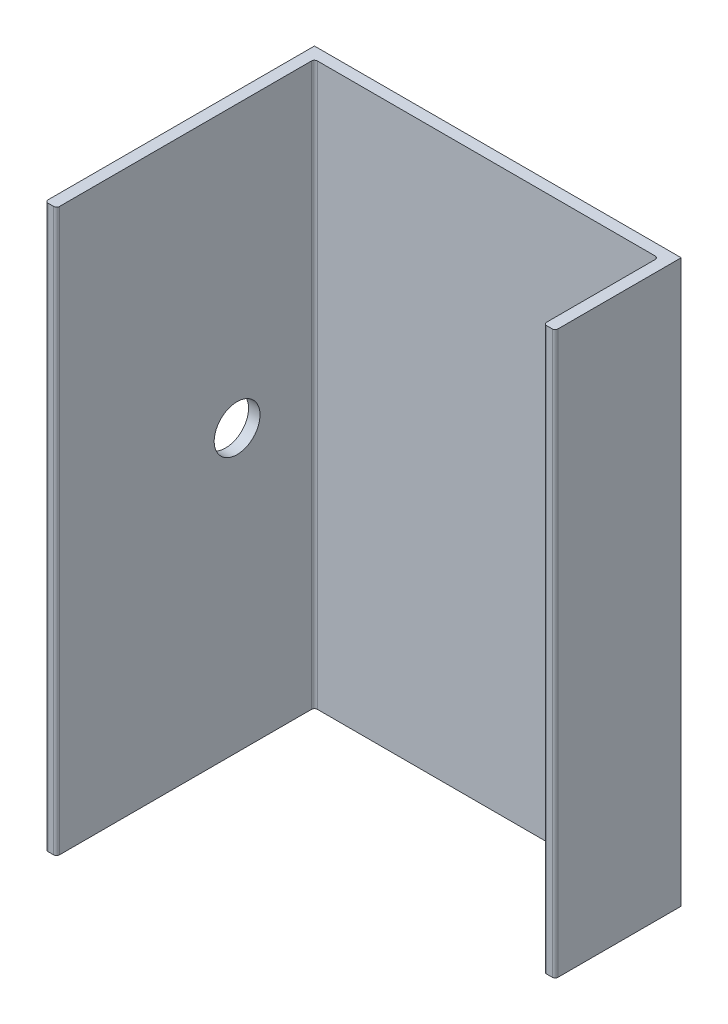
ISO-10303-21;
HEADER;
FILE_DESCRIPTION(('STEP AP214'),'2;1');
FILE_NAME('part.step','',(''),(''),'','','');
FILE_SCHEMA(('AUTOMOTIVE_DESIGN { 1 0 10303 214 1 1 1 1 }'));
ENDSEC;
DATA;
#1=APPLICATION_CONTEXT('core data for automotive mechanical design processes');
#2=APPLICATION_PROTOCOL_DEFINITION('international standard','automotive_design',2000,#1);
#3=PRODUCT_CONTEXT('',#1,'mechanical');
#4=PRODUCT('Part','Part','',(#3));
#5=PRODUCT_RELATED_PRODUCT_CATEGORY('part','',(#4));
#6=PRODUCT_DEFINITION_FORMATION('','',#4);
#7=PRODUCT_DEFINITION_CONTEXT('part definition',#1,'design');
#8=PRODUCT_DEFINITION('design','',#6,#7);
#9=PRODUCT_DEFINITION_SHAPE('','',#8);
#10=(LENGTH_UNIT() NAMED_UNIT(*) SI_UNIT(.MILLI.,.METRE.));
#11=(NAMED_UNIT(*) PLANE_ANGLE_UNIT() SI_UNIT($,.RADIAN.));
#12=(NAMED_UNIT(*) SI_UNIT($,.STERADIAN.) SOLID_ANGLE_UNIT());
#13=UNCERTAINTY_MEASURE_WITH_UNIT(LENGTH_MEASURE(1.E-05),#10,'distance_accuracy_value','');
#14=(GEOMETRIC_REPRESENTATION_CONTEXT(3) GLOBAL_UNCERTAINTY_ASSIGNED_CONTEXT((#13)) GLOBAL_UNIT_ASSIGNED_CONTEXT((#10,
#11,#12)) REPRESENTATION_CONTEXT('',''));
#15=CARTESIAN_POINT('',(0.,0.,0.));
#16=DIRECTION('',(0.,0.,1.));
#17=DIRECTION('',(1.,0.,0.));
#18=AXIS2_PLACEMENT_3D('',#15,#16,#17);
#19=CARTESIAN_POINT('',(0.,0.,0.));
#20=DIRECTION('',(0.,0.,1.));
#21=DIRECTION('',(1.,0.,0.));
#22=AXIS2_PLACEMENT_3D('',#19,#20,#21);
#23=PLANE('',#22);
#24=DIRECTION('',(1.,0.,0.));
#25=VECTOR('',#24,1.);
#26=CARTESIAN_POINT('',(-32.,-49.,0.));
#27=LINE('',#26,#25);
#28=CARTESIAN_POINT('',(-29.5,-49.,0.));
#29=VERTEX_POINT('',#28);
#30=CARTESIAN_POINT('',(29.5,-49.,0.));
#31=VERTEX_POINT('',#30);
#32=EDGE_CURVE('E166',#29,#31,#27,.T.);
#33=ORIENTED_EDGE('',*,*,#32,.T.);
#34=DIRECTION('',(0.,-1.,0.));
#35=VECTOR('',#34,1.);
#36=CARTESIAN_POINT('',(29.5,0.,0.));
#37=LINE('',#36,#35);
#38=CARTESIAN_POINT('',(29.5,49.,0.));
#39=VERTEX_POINT('',#38);
#40=EDGE_CURVE('E212',#31,#39,#37,.F.);
#41=ORIENTED_EDGE('',*,*,#40,.T.);
#42=DIRECTION('',(-1.,0.,0.));
#43=VECTOR('',#42,1.);
#44=CARTESIAN_POINT('',(-32.,49.,0.));
#45=LINE('',#44,#43);
#46=CARTESIAN_POINT('',(-29.5,49.,0.));
#47=VERTEX_POINT('',#46);
#48=EDGE_CURVE('E169',#39,#47,#45,.T.);
#49=ORIENTED_EDGE('',*,*,#48,.T.);
#50=DIRECTION('',(0.,1.,0.));
#51=VECTOR('',#50,1.);
#52=CARTESIAN_POINT('',(-29.5,0.,0.));
#53=LINE('',#52,#51);
#54=EDGE_CURVE('E210',#47,#29,#53,.F.);
#55=ORIENTED_EDGE('',*,*,#54,.T.);
#56=EDGE_LOOP('',(#33,#41,#49,#55));
#57=FACE_BOUND('',#56,.T.);
#58=ADVANCED_FACE('F37',(#57),#23,.T.);
#59=CARTESIAN_POINT('',(32.,49.,-2.));
#60=DIRECTION('',(1.,0.,0.));
#61=DIRECTION('',(0.,1.,0.));
#62=AXIS2_PLACEMENT_3D('',#59,#60,#61);
#63=PLANE('',#62);
#64=DIRECTION('',(0.,0.,1.));
#65=VECTOR('',#64,1.);
#66=CARTESIAN_POINT('',(32.,49.,-2.));
#67=LINE('',#66,#65);
#68=CARTESIAN_POINT('',(32.,49.,-2.));
#69=VERTEX_POINT('',#68);
#70=CARTESIAN_POINT('',(32.,49.,19.5));
#71=VERTEX_POINT('',#70);
#72=EDGE_CURVE('E140',#69,#71,#67,.T.);
#73=ORIENTED_EDGE('',*,*,#72,.T.);
#74=DIRECTION('',(0.,1.,0.));
#75=VECTOR('',#74,1.);
#76=CARTESIAN_POINT('',(32.,-49.,19.5));
#77=LINE('',#76,#75);
#78=CARTESIAN_POINT('',(32.,-49.,19.5));
#79=VERTEX_POINT('',#78);
#80=EDGE_CURVE('E197',#71,#79,#77,.F.);
#81=ORIENTED_EDGE('',*,*,#80,.T.);
#82=DIRECTION('',(0.,0.,1.));
#83=VECTOR('',#82,1.);
#84=CARTESIAN_POINT('',(32.,-49.,-2.));
#85=LINE('',#84,#83);
#86=CARTESIAN_POINT('',(32.,-49.,-2.));
#87=VERTEX_POINT('',#86);
#88=EDGE_CURVE('E165',#87,#79,#85,.T.);
#89=ORIENTED_EDGE('',*,*,#88,.F.);
#90=DIRECTION('',(0.,1.,0.));
#91=VECTOR('',#90,1.);
#92=CARTESIAN_POINT('',(32.,49.,-2.));
#93=LINE('',#92,#91);
#94=EDGE_CURVE('E158',#87,#69,#93,.T.);
#95=ORIENTED_EDGE('',*,*,#94,.T.);
#96=EDGE_LOOP('',(#73,#81,#89,#95));
#97=FACE_BOUND('',#96,.T.);
#98=ADVANCED_FACE('F163',(#97),#63,.T.);
#99=CARTESIAN_POINT('',(-32.,-49.,-2.));
#100=DIRECTION('',(0.,-1.,0.));
#101=DIRECTION('',(0.,0.,-1.));
#102=AXIS2_PLACEMENT_3D('',#99,#100,#101);
#103=PLANE('',#102);
#104=ORIENTED_EDGE('',*,*,#88,.T.);
#105=CARTESIAN_POINT('',(31.5,-49.,19.5));
#106=DIRECTION('',(0.,-1.,0.));
#107=DIRECTION('',(0.,0.,-1.));
#108=AXIS2_PLACEMENT_3D('',#105,#106,#107);
#109=CIRCLE('',#108,0.5);
#110=CARTESIAN_POINT('',(31.5,-49.,20.));
#111=VERTEX_POINT('',#110);
#112=EDGE_CURVE('E204',#79,#111,#109,.T.);
#113=ORIENTED_EDGE('',*,*,#112,.T.);
#114=DIRECTION('',(1.,0.,0.));
#115=VECTOR('',#114,1.);
#116=CARTESIAN_POINT('',(32.,-49.,20.));
#117=LINE('',#116,#115);
#118=CARTESIAN_POINT('',(30.5,-49.,20.));
#119=VERTEX_POINT('',#118);
#120=EDGE_CURVE('E261',#119,#111,#117,.T.);
#121=ORIENTED_EDGE('',*,*,#120,.F.);
#122=CARTESIAN_POINT('',(30.5,-49.,19.5));
#123=DIRECTION('',(0.,-1.,0.));
#124=DIRECTION('',(0.,0.,-1.));
#125=AXIS2_PLACEMENT_3D('',#122,#123,#124);
#126=CIRCLE('',#125,0.5);
#127=CARTESIAN_POINT('',(30.,-49.,19.5));
#128=VERTEX_POINT('',#127);
#129=EDGE_CURVE('E61',#119,#128,#126,.T.);
#130=ORIENTED_EDGE('',*,*,#129,.T.);
#131=DIRECTION('',(0.,0.,-1.));
#132=VECTOR('',#131,1.);
#133=CARTESIAN_POINT('',(30.,-49.,20.));
#134=LINE('',#133,#132);
#135=CARTESIAN_POINT('',(30.,-49.,0.5));
#136=VERTEX_POINT('',#135);
#137=EDGE_CURVE('E259',#128,#136,#134,.T.);
#138=ORIENTED_EDGE('',*,*,#137,.T.);
#139=CARTESIAN_POINT('',(29.5,-49.,0.5));
#140=DIRECTION('',(0.,-1.,0.));
#141=DIRECTION('',(0.,0.,-1.));
#142=AXIS2_PLACEMENT_3D('',#139,#140,#141);
#143=CIRCLE('',#142,0.5);
#144=EDGE_CURVE('E53',#136,#31,#143,.F.);
#145=ORIENTED_EDGE('',*,*,#144,.T.);
#146=ORIENTED_EDGE('',*,*,#32,.F.);
#147=CARTESIAN_POINT('',(-29.5,-49.,0.5));
#148=DIRECTION('',(0.,-1.,0.));
#149=DIRECTION('',(0.,0.,-1.));
#150=AXIS2_PLACEMENT_3D('',#147,#148,#149);
#151=CIRCLE('',#150,0.5);
#152=CARTESIAN_POINT('',(-30.,-49.,0.500000000000014));
#153=VERTEX_POINT('',#152);
#154=EDGE_CURVE('E11',#29,#153,#151,.F.);
#155=ORIENTED_EDGE('',*,*,#154,.T.);
#156=DIRECTION('',(0.,0.,-1.));
#157=VECTOR('',#156,1.);
#158=CARTESIAN_POINT('',(-30.,-49.,45.));
#159=LINE('',#158,#157);
#160=CARTESIAN_POINT('',(-30.,-49.,44.5));
#161=VERTEX_POINT('',#160);
#162=EDGE_CURVE('E172',#161,#153,#159,.T.);
#163=ORIENTED_EDGE('',*,*,#162,.F.);
#164=CARTESIAN_POINT('',(-30.5,-49.,44.5));
#165=DIRECTION('',(0.,-1.,0.));
#166=DIRECTION('',(0.,0.,-1.));
#167=AXIS2_PLACEMENT_3D('',#164,#165,#166);
#168=CIRCLE('',#167,0.5);
#169=CARTESIAN_POINT('',(-30.5,-49.,45.));
#170=VERTEX_POINT('',#169);
#171=EDGE_CURVE('E199',#161,#170,#168,.T.);
#172=ORIENTED_EDGE('',*,*,#171,.T.);
#173=DIRECTION('',(1.,0.,0.));
#174=VECTOR('',#173,1.);
#175=CARTESIAN_POINT('',(-32.,-49.,45.));
#176=LINE('',#175,#174);
#177=CARTESIAN_POINT('',(-31.5,-49.,45.));
#178=VERTEX_POINT('',#177);
#179=EDGE_CURVE('E251',#178,#170,#176,.T.);
#180=ORIENTED_EDGE('',*,*,#179,.F.);
#181=CARTESIAN_POINT('',(-31.5,-49.,44.5));
#182=DIRECTION('',(0.,-1.,0.));
#183=DIRECTION('',(0.,0.,-1.));
#184=AXIS2_PLACEMENT_3D('',#181,#182,#183);
#185=CIRCLE('',#184,0.5);
#186=CARTESIAN_POINT('',(-32.,-49.,44.5));
#187=VERTEX_POINT('',#186);
#188=EDGE_CURVE('E201',#178,#187,#185,.T.);
#189=ORIENTED_EDGE('',*,*,#188,.T.);
#190=DIRECTION('',(0.,0.,1.));
#191=VECTOR('',#190,1.);
#192=CARTESIAN_POINT('',(-32.,-49.,-2.));
#193=LINE('',#192,#191);
#194=CARTESIAN_POINT('',(-32.,-49.,-2.));
#195=VERTEX_POINT('',#194);
#196=EDGE_CURVE('E181',#195,#187,#193,.T.);
#197=ORIENTED_EDGE('',*,*,#196,.F.);
#198=DIRECTION('',(1.,0.,0.));
#199=VECTOR('',#198,1.);
#200=CARTESIAN_POINT('',(-32.,-49.,-2.));
#201=LINE('',#200,#199);
#202=EDGE_CURVE('E151',#195,#87,#201,.T.);
#203=ORIENTED_EDGE('',*,*,#202,.T.);
#204=EDGE_LOOP('',(#104,#113,#121,#130,#138,#145,#146,#155,#163,#172,#180,#189,#197,#203));
#205=FACE_BOUND('',#204,.T.);
#206=ADVANCED_FACE('F244',(#205),#103,.T.);
#207=CARTESIAN_POINT('',(-32.,49.,-2.));
#208=DIRECTION('',(-1.,0.,0.));
#209=DIRECTION('',(0.,-1.,0.));
#210=AXIS2_PLACEMENT_3D('',#207,#208,#209);
#211=PLANE('',#210);
#212=CARTESIAN_POINT('',(-32.,0.,13.5));
#213=DIRECTION('',(-1.,0.,0.));
#214=DIRECTION('',(0.,-1.,0.));
#215=AXIS2_PLACEMENT_3D('',#212,#213,#214);
#216=CIRCLE('',#215,4.);
#217=CARTESIAN_POINT('',(-32.,-4.00000000000001,13.5));
#218=VERTEX_POINT('',#217);
#219=EDGE_CURVE('E267',#218,#218,#216,.T.);
#220=ORIENTED_EDGE('',*,*,#219,.F.);
#221=EDGE_LOOP('',(#220));
#222=FACE_BOUND('',#221,.T.);
#223=ORIENTED_EDGE('',*,*,#196,.T.);
#224=DIRECTION('',(0.,-1.,0.));
#225=VECTOR('',#224,1.);
#226=CARTESIAN_POINT('',(-32.,49.,44.5));
#227=LINE('',#226,#225);
#228=CARTESIAN_POINT('',(-32.,49.,44.5));
#229=VERTEX_POINT('',#228);
#230=EDGE_CURVE('E225',#187,#229,#227,.F.);
#231=ORIENTED_EDGE('',*,*,#230,.T.);
#232=DIRECTION('',(0.,0.,1.));
#233=VECTOR('',#232,1.);
#234=CARTESIAN_POINT('',(-32.,49.,-2.));
#235=LINE('',#234,#233);
#236=CARTESIAN_POINT('',(-32.,49.,-2.));
#237=VERTEX_POINT('',#236);
#238=EDGE_CURVE('E150',#237,#229,#235,.T.);
#239=ORIENTED_EDGE('',*,*,#238,.F.);
#240=DIRECTION('',(0.,-1.,0.));
#241=VECTOR('',#240,1.);
#242=CARTESIAN_POINT('',(-32.,49.,-2.));
#243=LINE('',#242,#241);
#244=EDGE_CURVE('E161',#237,#195,#243,.T.);
#245=ORIENTED_EDGE('',*,*,#244,.T.);
#246=EDGE_LOOP('',(#223,#231,#239,#245));
#247=FACE_BOUND('',#246,.T.);
#248=ADVANCED_FACE('F295',(#222,#247),#211,.T.);
#249=CARTESIAN_POINT('',(-32.,49.,-2.));
#250=DIRECTION('',(0.,1.,0.));
#251=DIRECTION('',(0.,0.,1.));
#252=AXIS2_PLACEMENT_3D('',#249,#250,#251);
#253=PLANE('',#252);
#254=DIRECTION('',(-1.,0.,0.));
#255=VECTOR('',#254,1.);
#256=CARTESIAN_POINT('',(32.,49.,20.));
#257=LINE('',#256,#255);
#258=CARTESIAN_POINT('',(31.5,49.,20.));
#259=VERTEX_POINT('',#258);
#260=CARTESIAN_POINT('',(30.5,49.,20.));
#261=VERTEX_POINT('',#260);
#262=EDGE_CURVE('E264',#259,#261,#257,.T.);
#263=ORIENTED_EDGE('',*,*,#262,.F.);
#264=CARTESIAN_POINT('',(31.5,49.,19.5));
#265=DIRECTION('',(0.,1.,0.));
#266=DIRECTION('',(0.,0.,1.));
#267=AXIS2_PLACEMENT_3D('',#264,#265,#266);
#268=CIRCLE('',#267,0.5);
#269=EDGE_CURVE('E146',#259,#71,#268,.T.);
#270=ORIENTED_EDGE('',*,*,#269,.T.);
#271=ORIENTED_EDGE('',*,*,#72,.F.);
#272=DIRECTION('',(-1.,0.,0.));
#273=VECTOR('',#272,1.);
#274=CARTESIAN_POINT('',(-32.,49.,-2.));
#275=LINE('',#274,#273);
#276=EDGE_CURVE('E145',#69,#237,#275,.T.);
#277=ORIENTED_EDGE('',*,*,#276,.T.);
#278=ORIENTED_EDGE('',*,*,#238,.T.);
#279=CARTESIAN_POINT('',(-31.5,49.,44.5));
#280=DIRECTION('',(0.,1.,0.));
#281=DIRECTION('',(0.,0.,1.));
#282=AXIS2_PLACEMENT_3D('',#279,#280,#281);
#283=CIRCLE('',#282,0.5);
#284=CARTESIAN_POINT('',(-31.5,49.,45.));
#285=VERTEX_POINT('',#284);
#286=EDGE_CURVE('E192',#229,#285,#283,.T.);
#287=ORIENTED_EDGE('',*,*,#286,.T.);
#288=DIRECTION('',(-1.,0.,0.));
#289=VECTOR('',#288,1.);
#290=CARTESIAN_POINT('',(-32.,49.,45.));
#291=LINE('',#290,#289);
#292=CARTESIAN_POINT('',(-30.5,49.,45.));
#293=VERTEX_POINT('',#292);
#294=EDGE_CURVE('E249',#293,#285,#291,.T.);
#295=ORIENTED_EDGE('',*,*,#294,.F.);
#296=CARTESIAN_POINT('',(-30.5,49.,44.5));
#297=DIRECTION('',(0.,1.,0.));
#298=DIRECTION('',(0.,0.,1.));
#299=AXIS2_PLACEMENT_3D('',#296,#297,#298);
#300=CIRCLE('',#299,0.5);
#301=CARTESIAN_POINT('',(-30.,49.,44.5));
#302=VERTEX_POINT('',#301);
#303=EDGE_CURVE('E190',#293,#302,#300,.T.);
#304=ORIENTED_EDGE('',*,*,#303,.T.);
#305=DIRECTION('',(0.,0.,-1.));
#306=VECTOR('',#305,1.);
#307=CARTESIAN_POINT('',(-30.,49.,45.));
#308=LINE('',#307,#306);
#309=CARTESIAN_POINT('',(-30.,49.,0.500000000000014));
#310=VERTEX_POINT('',#309);
#311=EDGE_CURVE('E234',#302,#310,#308,.T.);
#312=ORIENTED_EDGE('',*,*,#311,.T.);
#313=CARTESIAN_POINT('',(-29.5,49.,0.5));
#314=DIRECTION('',(0.,1.,0.));
#315=DIRECTION('',(0.,0.,1.));
#316=AXIS2_PLACEMENT_3D('',#313,#314,#315);
#317=CIRCLE('',#316,0.5);
#318=EDGE_CURVE('E46',#310,#47,#317,.F.);
#319=ORIENTED_EDGE('',*,*,#318,.T.);
#320=ORIENTED_EDGE('',*,*,#48,.F.);
#321=CARTESIAN_POINT('',(29.5,49.,0.5));
#322=DIRECTION('',(0.,1.,0.));
#323=DIRECTION('',(0.,0.,1.));
#324=AXIS2_PLACEMENT_3D('',#321,#322,#323);
#325=CIRCLE('',#324,0.5);
#326=CARTESIAN_POINT('',(30.,49.,0.5));
#327=VERTEX_POINT('',#326);
#328=EDGE_CURVE('E228',#39,#327,#325,.F.);
#329=ORIENTED_EDGE('',*,*,#328,.T.);
#330=DIRECTION('',(0.,0.,-1.));
#331=VECTOR('',#330,1.);
#332=CARTESIAN_POINT('',(30.,49.,20.));
#333=LINE('',#332,#331);
#334=CARTESIAN_POINT('',(30.,49.,19.5));
#335=VERTEX_POINT('',#334);
#336=EDGE_CURVE('E256',#335,#327,#333,.T.);
#337=ORIENTED_EDGE('',*,*,#336,.F.);
#338=CARTESIAN_POINT('',(30.5,49.,19.5));
#339=DIRECTION('',(0.,1.,0.));
#340=DIRECTION('',(0.,0.,1.));
#341=AXIS2_PLACEMENT_3D('',#338,#339,#340);
#342=CIRCLE('',#341,0.5);
#343=EDGE_CURVE('E194',#335,#261,#342,.T.);
#344=ORIENTED_EDGE('',*,*,#343,.T.);
#345=EDGE_LOOP('',(#263,#270,#271,#277,#278,#287,#295,#304,#312,#319,#320,#329,#337,#344));
#346=FACE_BOUND('',#345,.T.);
#347=ADVANCED_FACE('F143',(#346),#253,.T.);
#348=CARTESIAN_POINT('',(0.,0.,-2.));
#349=DIRECTION('',(0.,0.,1.));
#350=DIRECTION('',(1.,0.,0.));
#351=AXIS2_PLACEMENT_3D('',#348,#349,#350);
#352=PLANE('',#351);
#353=ORIENTED_EDGE('',*,*,#94,.F.);
#354=ORIENTED_EDGE('',*,*,#202,.F.);
#355=ORIENTED_EDGE('',*,*,#244,.F.);
#356=ORIENTED_EDGE('',*,*,#276,.F.);
#357=EDGE_LOOP('',(#353,#354,#355,#356));
#358=FACE_BOUND('',#357,.T.);
#359=ADVANCED_FACE('F156',(#358),#352,.F.);
#360=CARTESIAN_POINT('',(-30.,49.,45.));
#361=DIRECTION('',(-1.,0.,0.));
#362=DIRECTION('',(0.,-1.,0.));
#363=AXIS2_PLACEMENT_3D('',#360,#361,#362);
#364=PLANE('',#363);
#365=CARTESIAN_POINT('',(-30.,0.,13.5));
#366=DIRECTION('',(-1.,0.,0.));
#367=DIRECTION('',(0.,-1.,0.));
#368=AXIS2_PLACEMENT_3D('',#365,#366,#367);
#369=CIRCLE('',#368,4.);
#370=CARTESIAN_POINT('',(-30.,-4.00000000000001,13.5));
#371=VERTEX_POINT('',#370);
#372=EDGE_CURVE('E41',#371,#371,#369,.T.);
#373=ORIENTED_EDGE('',*,*,#372,.T.);
#374=EDGE_LOOP('',(#373));
#375=FACE_BOUND('',#374,.T.);
#376=ORIENTED_EDGE('',*,*,#162,.T.);
#377=DIRECTION('',(0.,1.,0.));
#378=VECTOR('',#377,1.);
#379=CARTESIAN_POINT('',(-30.,49.,0.5));
#380=LINE('',#379,#378);
#381=EDGE_CURVE('E216',#153,#310,#380,.T.);
#382=ORIENTED_EDGE('',*,*,#381,.T.);
#383=ORIENTED_EDGE('',*,*,#311,.F.);
#384=DIRECTION('',(0.,1.,0.));
#385=VECTOR('',#384,1.);
#386=CARTESIAN_POINT('',(-30.,-49.,44.5));
#387=LINE('',#386,#385);
#388=EDGE_CURVE('E214',#302,#161,#387,.F.);
#389=ORIENTED_EDGE('',*,*,#388,.T.);
#390=EDGE_LOOP('',(#376,#382,#383,#389));
#391=FACE_BOUND('',#390,.T.);
#392=ADVANCED_FACE('F247',(#375,#391),#364,.F.);
#393=CARTESIAN_POINT('',(0.,0.,45.));
#394=DIRECTION('',(0.,0.,1.));
#395=DIRECTION('',(1.,0.,0.));
#396=AXIS2_PLACEMENT_3D('',#393,#394,#395);
#397=PLANE('',#396);
#398=ORIENTED_EDGE('',*,*,#294,.T.);
#399=DIRECTION('',(0.,-1.,0.));
#400=VECTOR('',#399,1.);
#401=CARTESIAN_POINT('',(-31.5,0.,45.));
#402=LINE('',#401,#400);
#403=EDGE_CURVE('E222',#285,#178,#402,.T.);
#404=ORIENTED_EDGE('',*,*,#403,.T.);
#405=ORIENTED_EDGE('',*,*,#179,.T.);
#406=DIRECTION('',(0.,1.,0.));
#407=VECTOR('',#406,1.);
#408=CARTESIAN_POINT('',(-30.5,49.,45.));
#409=LINE('',#408,#407);
#410=EDGE_CURVE('E219',#170,#293,#409,.T.);
#411=ORIENTED_EDGE('',*,*,#410,.T.);
#412=EDGE_LOOP('',(#398,#404,#405,#411));
#413=FACE_BOUND('',#412,.T.);
#414=ADVANCED_FACE('F323',(#413),#397,.T.);
#415=CARTESIAN_POINT('',(30.,49.,20.));
#416=DIRECTION('',(1.,0.,0.));
#417=DIRECTION('',(0.,1.,0.));
#418=AXIS2_PLACEMENT_3D('',#415,#416,#417);
#419=PLANE('',#418);
#420=ORIENTED_EDGE('',*,*,#137,.F.);
#421=DIRECTION('',(0.,-1.,0.));
#422=VECTOR('',#421,1.);
#423=CARTESIAN_POINT('',(30.,49.,19.5));
#424=LINE('',#423,#422);
#425=EDGE_CURVE('E208',#128,#335,#424,.F.);
#426=ORIENTED_EDGE('',*,*,#425,.T.);
#427=ORIENTED_EDGE('',*,*,#336,.T.);
#428=DIRECTION('',(0.,-1.,0.));
#429=VECTOR('',#428,1.);
#430=CARTESIAN_POINT('',(30.,49.,0.5));
#431=LINE('',#430,#429);
#432=EDGE_CURVE('E206',#327,#136,#431,.T.);
#433=ORIENTED_EDGE('',*,*,#432,.T.);
#434=EDGE_LOOP('',(#420,#426,#427,#433));
#435=FACE_BOUND('',#434,.T.);
#436=ADVANCED_FACE('F335',(#435),#419,.F.);
#437=CARTESIAN_POINT('',(0.,0.,20.));
#438=DIRECTION('',(0.,0.,-1.));
#439=DIRECTION('',(-1.,0.,0.));
#440=AXIS2_PLACEMENT_3D('',#437,#438,#439);
#441=PLANE('',#440);
#442=ORIENTED_EDGE('',*,*,#120,.T.);
#443=DIRECTION('',(0.,1.,0.));
#444=VECTOR('',#443,1.);
#445=CARTESIAN_POINT('',(31.5,49.,20.));
#446=LINE('',#445,#444);
#447=EDGE_CURVE('E187',#111,#259,#446,.T.);
#448=ORIENTED_EDGE('',*,*,#447,.T.);
#449=ORIENTED_EDGE('',*,*,#262,.T.);
#450=DIRECTION('',(0.,-1.,0.));
#451=VECTOR('',#450,1.);
#452=CARTESIAN_POINT('',(30.5,0.,20.));
#453=LINE('',#452,#451);
#454=EDGE_CURVE('E180',#261,#119,#453,.T.);
#455=ORIENTED_EDGE('',*,*,#454,.T.);
#456=EDGE_LOOP('',(#442,#448,#449,#455));
#457=FACE_BOUND('',#456,.T.);
#458=ADVANCED_FACE('F305',(#457),#441,.F.);
#459=CARTESIAN_POINT('',(31.5,0.,19.5));
#460=DIRECTION('',(0.,-1.,0.));
#461=DIRECTION('',(1.,0.,0.));
#462=AXIS2_PLACEMENT_3D('',#459,#460,#461);
#463=CYLINDRICAL_SURFACE('',#462,0.5);
#464=ORIENTED_EDGE('',*,*,#112,.F.);
#465=ORIENTED_EDGE('',*,*,#80,.F.);
#466=ORIENTED_EDGE('',*,*,#269,.F.);
#467=ORIENTED_EDGE('',*,*,#447,.F.);
#468=EDGE_LOOP('',(#464,#465,#466,#467));
#469=FACE_BOUND('',#468,.T.);
#470=ADVANCED_FACE('F301',(#469),#463,.T.);
#471=CARTESIAN_POINT('',(30.5,0.,19.5));
#472=DIRECTION('',(0.,-1.,0.));
#473=DIRECTION('',(1.,0.,0.));
#474=AXIS2_PLACEMENT_3D('',#471,#472,#473);
#475=CYLINDRICAL_SURFACE('',#474,0.5);
#476=ORIENTED_EDGE('',*,*,#343,.F.);
#477=ORIENTED_EDGE('',*,*,#425,.F.);
#478=ORIENTED_EDGE('',*,*,#129,.F.);
#479=ORIENTED_EDGE('',*,*,#454,.F.);
#480=EDGE_LOOP('',(#476,#477,#478,#479));
#481=FACE_BOUND('',#480,.T.);
#482=ADVANCED_FACE('F304',(#481),#475,.T.);
#483=CARTESIAN_POINT('',(29.5,49.,0.5));
#484=DIRECTION('',(0.,-1.,0.));
#485=DIRECTION('',(1.,0.,0.));
#486=AXIS2_PLACEMENT_3D('',#483,#484,#485);
#487=CYLINDRICAL_SURFACE('',#486,0.5);
#488=ORIENTED_EDGE('',*,*,#328,.F.);
#489=ORIENTED_EDGE('',*,*,#40,.F.);
#490=ORIENTED_EDGE('',*,*,#144,.F.);
#491=ORIENTED_EDGE('',*,*,#432,.F.);
#492=EDGE_LOOP('',(#488,#489,#490,#491));
#493=FACE_BOUND('',#492,.T.);
#494=ADVANCED_FACE('F309',(#493),#487,.F.);
#495=CARTESIAN_POINT('',(-29.5,49.,0.5));
#496=DIRECTION('',(0.,1.,0.));
#497=DIRECTION('',(-1.,0.,0.));
#498=AXIS2_PLACEMENT_3D('',#495,#496,#497);
#499=CYLINDRICAL_SURFACE('',#498,0.5);
#500=ORIENTED_EDGE('',*,*,#154,.F.);
#501=ORIENTED_EDGE('',*,*,#54,.F.);
#502=ORIENTED_EDGE('',*,*,#318,.F.);
#503=ORIENTED_EDGE('',*,*,#381,.F.);
#504=EDGE_LOOP('',(#500,#501,#502,#503));
#505=FACE_BOUND('',#504,.T.);
#506=ADVANCED_FACE('F241',(#505),#499,.F.);
#507=CARTESIAN_POINT('',(-31.5,0.,44.5));
#508=DIRECTION('',(0.,-1.,0.));
#509=DIRECTION('',(1.,0.,0.));
#510=AXIS2_PLACEMENT_3D('',#507,#508,#509);
#511=CYLINDRICAL_SURFACE('',#510,0.5);
#512=ORIENTED_EDGE('',*,*,#286,.F.);
#513=ORIENTED_EDGE('',*,*,#230,.F.);
#514=ORIENTED_EDGE('',*,*,#188,.F.);
#515=ORIENTED_EDGE('',*,*,#403,.F.);
#516=EDGE_LOOP('',(#512,#513,#514,#515));
#517=FACE_BOUND('',#516,.T.);
#518=ADVANCED_FACE('F281',(#517),#511,.T.);
#519=CARTESIAN_POINT('',(-30.5,0.,44.5));
#520=DIRECTION('',(0.,-1.,0.));
#521=DIRECTION('',(1.,0.,0.));
#522=AXIS2_PLACEMENT_3D('',#519,#520,#521);
#523=CYLINDRICAL_SURFACE('',#522,0.5);
#524=ORIENTED_EDGE('',*,*,#171,.F.);
#525=ORIENTED_EDGE('',*,*,#388,.F.);
#526=ORIENTED_EDGE('',*,*,#303,.F.);
#527=ORIENTED_EDGE('',*,*,#410,.F.);
#528=EDGE_LOOP('',(#524,#525,#526,#527));
#529=FACE_BOUND('',#528,.T.);
#530=ADVANCED_FACE('F39',(#529),#523,.T.);
#531=CARTESIAN_POINT('',(-22.,0.,13.5));
#532=DIRECTION('',(-1.,0.,0.));
#533=DIRECTION('',(0.,-1.,0.));
#534=AXIS2_PLACEMENT_3D('',#531,#532,#533);
#535=CYLINDRICAL_SURFACE('',#534,4.);
#536=ORIENTED_EDGE('',*,*,#219,.T.);
#537=EDGE_LOOP('',(#536));
#538=FACE_BOUND('',#537,.T.);
#539=ORIENTED_EDGE('',*,*,#372,.F.);
#540=EDGE_LOOP('',(#539));
#541=FACE_BOUND('',#540,.T.);
#542=ADVANCED_FACE('F275',(#538,#541),#535,.F.);
#543=CLOSED_SHELL('',(#58,#98,#206,#248,#347,#359,#392,#414,#436,#458,#470,#482,#494,#506,#518,
#530,#542));
#544=MANIFOLD_SOLID_BREP('B2',#543);
#545=ADVANCED_BREP_SHAPE_REPRESENTATION('',(#18,#544),#14);
#546=SHAPE_DEFINITION_REPRESENTATION(#9,#545);
ENDSEC;
END-ISO-10303-21;
